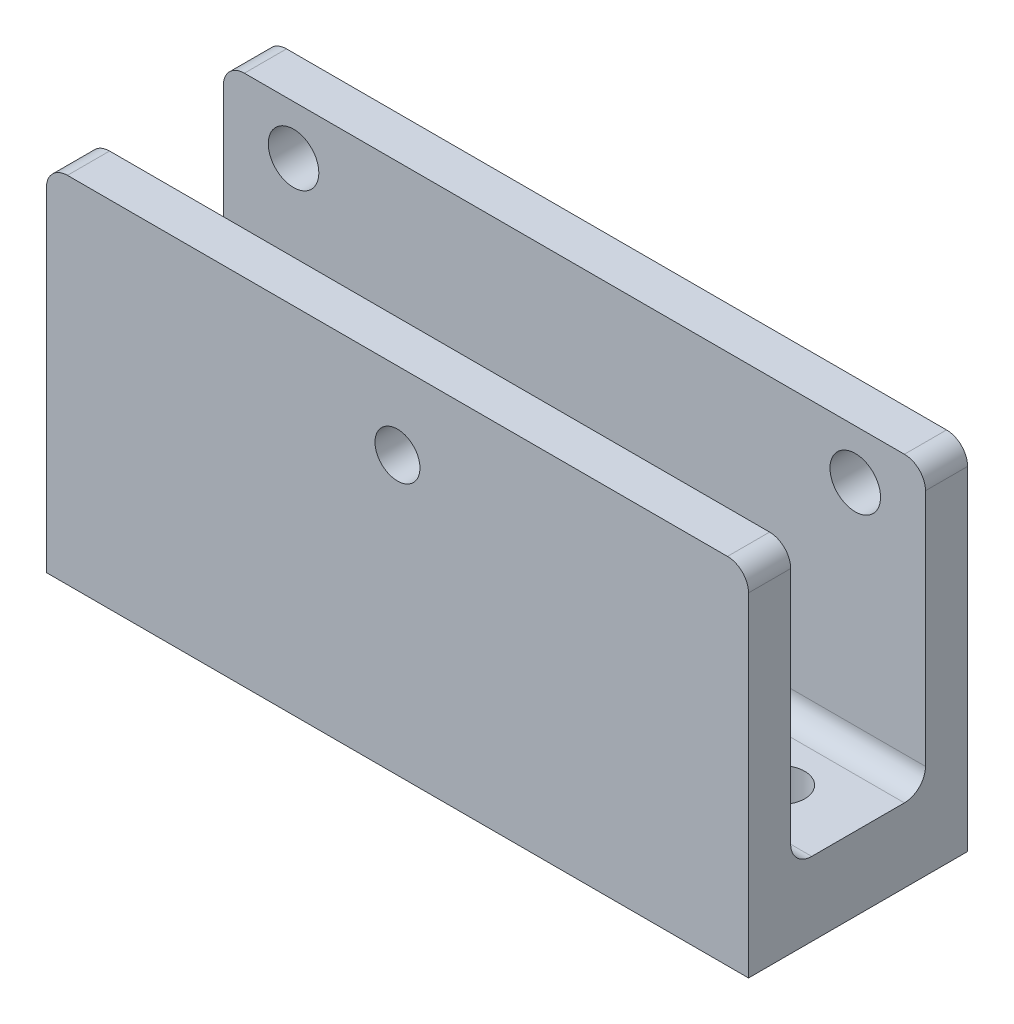
ISO-10303-21;
HEADER;
FILE_DESCRIPTION(('STEP AP214'),'2;1');
FILE_NAME('part.step','',(''),(''),'','','');
FILE_SCHEMA(('AUTOMOTIVE_DESIGN { 1 0 10303 214 1 1 1 1 }'));
ENDSEC;
DATA;
#1=APPLICATION_CONTEXT('core data for automotive mechanical design processes');
#2=APPLICATION_PROTOCOL_DEFINITION('international standard','automotive_design',2000,#1);
#3=PRODUCT_CONTEXT('',#1,'mechanical');
#4=PRODUCT('Part','Part','',(#3));
#5=PRODUCT_RELATED_PRODUCT_CATEGORY('part','',(#4));
#6=PRODUCT_DEFINITION_FORMATION('','',#4);
#7=PRODUCT_DEFINITION_CONTEXT('part definition',#1,'design');
#8=PRODUCT_DEFINITION('design','',#6,#7);
#9=PRODUCT_DEFINITION_SHAPE('','',#8);
#10=(LENGTH_UNIT() NAMED_UNIT(*) SI_UNIT(.MILLI.,.METRE.));
#11=(NAMED_UNIT(*) PLANE_ANGLE_UNIT() SI_UNIT($,.RADIAN.));
#12=(NAMED_UNIT(*) SI_UNIT($,.STERADIAN.) SOLID_ANGLE_UNIT());
#13=UNCERTAINTY_MEASURE_WITH_UNIT(LENGTH_MEASURE(1.E-05),#10,'distance_accuracy_value','');
#14=(GEOMETRIC_REPRESENTATION_CONTEXT(3) GLOBAL_UNCERTAINTY_ASSIGNED_CONTEXT((#13)) GLOBAL_UNIT_ASSIGNED_CONTEXT((#10,
#11,#12)) REPRESENTATION_CONTEXT('',''));
#15=CARTESIAN_POINT('',(0.,0.,0.));
#16=DIRECTION('',(0.,0.,1.));
#17=DIRECTION('',(1.,0.,0.));
#18=AXIS2_PLACEMENT_3D('',#15,#16,#17);
#19=CARTESIAN_POINT('',(25.,5.25,-4.8));
#20=DIRECTION('',(-1.,0.,0.));
#21=DIRECTION('',(0.,0.,1.));
#22=AXIS2_PLACEMENT_3D('',#19,#20,#21);
#23=PLANE('',#22);
#24=DIRECTION('',(0.,1.,0.));
#25=VECTOR('',#24,1.);
#26=CARTESIAN_POINT('',(25.,0.,-7.8));
#27=LINE('',#26,#25);
#28=CARTESIAN_POINT('',(25.,0.,-7.8));
#29=VERTEX_POINT('',#28);
#30=CARTESIAN_POINT('',(25.,23.75,-7.8));
#31=VERTEX_POINT('',#30);
#32=EDGE_CURVE('E171',#29,#31,#27,.T.);
#33=ORIENTED_EDGE('',*,*,#32,.T.);
#34=DIRECTION('',(0.,0.,1.));
#35=VECTOR('',#34,1.);
#36=CARTESIAN_POINT('',(25.,23.75,-4.8));
#37=LINE('',#36,#35);
#38=CARTESIAN_POINT('',(25.,23.75,-4.8));
#39=VERTEX_POINT('',#38);
#40=EDGE_CURVE('E11',#31,#39,#37,.T.);
#41=ORIENTED_EDGE('',*,*,#40,.T.);
#42=DIRECTION('',(0.,1.,0.));
#43=VECTOR('',#42,1.);
#44=CARTESIAN_POINT('',(25.,0.,-4.8));
#45=LINE('',#44,#43);
#46=CARTESIAN_POINT('',(25.,6.75,-4.8));
#47=VERTEX_POINT('',#46);
#48=EDGE_CURVE('E209',#47,#39,#45,.T.);
#49=ORIENTED_EDGE('',*,*,#48,.F.);
#50=CARTESIAN_POINT('',(25.,6.75,-3.3));
#51=DIRECTION('',(-1.,0.,0.));
#52=DIRECTION('',(0.,0.,1.));
#53=AXIS2_PLACEMENT_3D('',#50,#51,#52);
#54=CIRCLE('',#53,1.5);
#55=CARTESIAN_POINT('',(25.,5.25,-3.3));
#56=VERTEX_POINT('',#55);
#57=EDGE_CURVE('E330',#47,#56,#54,.T.);
#58=ORIENTED_EDGE('',*,*,#57,.T.);
#59=DIRECTION('',(0.,0.,-1.));
#60=VECTOR('',#59,1.);
#61=CARTESIAN_POINT('',(25.,5.25,-4.8));
#62=LINE('',#61,#60);
#63=CARTESIAN_POINT('',(25.,5.25,3.3));
#64=VERTEX_POINT('',#63);
#65=EDGE_CURVE('E283',#64,#56,#62,.T.);
#66=ORIENTED_EDGE('',*,*,#65,.F.);
#67=CARTESIAN_POINT('',(25.,6.75,3.3));
#68=DIRECTION('',(-1.,0.,0.));
#69=DIRECTION('',(0.,0.,1.));
#70=AXIS2_PLACEMENT_3D('',#67,#68,#69);
#71=CIRCLE('',#70,1.5);
#72=CARTESIAN_POINT('',(25.,6.75,4.8));
#73=VERTEX_POINT('',#72);
#74=EDGE_CURVE('E320',#64,#73,#71,.T.);
#75=ORIENTED_EDGE('',*,*,#74,.T.);
#76=DIRECTION('',(0.,1.,0.));
#77=VECTOR('',#76,1.);
#78=CARTESIAN_POINT('',(25.,0.,4.8));
#79=LINE('',#78,#77);
#80=CARTESIAN_POINT('',(25.,23.75,4.8));
#81=VERTEX_POINT('',#80);
#82=EDGE_CURVE('E197',#73,#81,#79,.T.);
#83=ORIENTED_EDGE('',*,*,#82,.T.);
#84=DIRECTION('',(0.,0.,-1.));
#85=VECTOR('',#84,1.);
#86=CARTESIAN_POINT('',(25.,23.75,-4.8));
#87=LINE('',#86,#85);
#88=CARTESIAN_POINT('',(25.,23.75,7.8));
#89=VERTEX_POINT('',#88);
#90=EDGE_CURVE('E48',#81,#89,#87,.F.);
#91=ORIENTED_EDGE('',*,*,#90,.T.);
#92=DIRECTION('',(0.,1.,0.));
#93=VECTOR('',#92,1.);
#94=CARTESIAN_POINT('',(25.,0.,7.8));
#95=LINE('',#94,#93);
#96=CARTESIAN_POINT('',(25.,0.,7.8));
#97=VERTEX_POINT('',#96);
#98=EDGE_CURVE('E173',#97,#89,#95,.T.);
#99=ORIENTED_EDGE('',*,*,#98,.F.);
#100=DIRECTION('',(0.,0.,-1.));
#101=VECTOR('',#100,1.);
#102=CARTESIAN_POINT('',(25.,0.,-4.8));
#103=LINE('',#102,#101);
#104=EDGE_CURVE('E170',#97,#29,#103,.T.);
#105=ORIENTED_EDGE('',*,*,#104,.T.);
#106=EDGE_LOOP('',(#33,#41,#49,#58,#66,#75,#83,#91,#99,#105));
#107=FACE_BOUND('',#106,.T.);
#108=ADVANCED_FACE('F39',(#107),#23,.F.);
#109=CARTESIAN_POINT('',(-25.,5.25,-4.8));
#110=DIRECTION('',(1.,0.,0.));
#111=DIRECTION('',(0.,0.,-1.));
#112=AXIS2_PLACEMENT_3D('',#109,#110,#111);
#113=PLANE('',#112);
#114=DIRECTION('',(0.,-1.,0.));
#115=VECTOR('',#114,1.);
#116=CARTESIAN_POINT('',(-25.,0.,7.8));
#117=LINE('',#116,#115);
#118=CARTESIAN_POINT('',(-25.,23.75,7.8));
#119=VERTEX_POINT('',#118);
#120=CARTESIAN_POINT('',(-25.,0.,7.8));
#121=VERTEX_POINT('',#120);
#122=EDGE_CURVE('E214',#119,#121,#117,.T.);
#123=ORIENTED_EDGE('',*,*,#122,.F.);
#124=DIRECTION('',(0.,0.,-1.));
#125=VECTOR('',#124,1.);
#126=CARTESIAN_POINT('',(-25.,23.75,-4.8));
#127=LINE('',#126,#125);
#128=CARTESIAN_POINT('',(-25.,23.75,4.8));
#129=VERTEX_POINT('',#128);
#130=EDGE_CURVE('E336',#119,#129,#127,.T.);
#131=ORIENTED_EDGE('',*,*,#130,.T.);
#132=DIRECTION('',(0.,-1.,0.));
#133=VECTOR('',#132,1.);
#134=CARTESIAN_POINT('',(-25.,0.,4.8));
#135=LINE('',#134,#133);
#136=CARTESIAN_POINT('',(-25.,6.75,4.8));
#137=VERTEX_POINT('',#136);
#138=EDGE_CURVE('E193',#129,#137,#135,.T.);
#139=ORIENTED_EDGE('',*,*,#138,.T.);
#140=CARTESIAN_POINT('',(-25.,6.75,3.3));
#141=DIRECTION('',(1.,0.,0.));
#142=DIRECTION('',(0.,0.,-1.));
#143=AXIS2_PLACEMENT_3D('',#140,#141,#142);
#144=CIRCLE('',#143,1.5);
#145=CARTESIAN_POINT('',(-25.,5.25,3.3));
#146=VERTEX_POINT('',#145);
#147=EDGE_CURVE('E323',#137,#146,#144,.T.);
#148=ORIENTED_EDGE('',*,*,#147,.T.);
#149=DIRECTION('',(0.,0.,1.));
#150=VECTOR('',#149,1.);
#151=CARTESIAN_POINT('',(-25.,5.25,-4.8));
#152=LINE('',#151,#150);
#153=CARTESIAN_POINT('',(-25.,5.25,-3.3));
#154=VERTEX_POINT('',#153);
#155=EDGE_CURVE('E287',#154,#146,#152,.T.);
#156=ORIENTED_EDGE('',*,*,#155,.F.);
#157=CARTESIAN_POINT('',(-25.,6.75,-3.3));
#158=DIRECTION('',(1.,0.,0.));
#159=DIRECTION('',(0.,0.,-1.));
#160=AXIS2_PLACEMENT_3D('',#157,#158,#159);
#161=CIRCLE('',#160,1.5);
#162=CARTESIAN_POINT('',(-25.,6.75,-4.8));
#163=VERTEX_POINT('',#162);
#164=EDGE_CURVE('E326',#154,#163,#161,.T.);
#165=ORIENTED_EDGE('',*,*,#164,.T.);
#166=DIRECTION('',(0.,-1.,0.));
#167=VECTOR('',#166,1.);
#168=CARTESIAN_POINT('',(-25.,0.,-4.8));
#169=LINE('',#168,#167);
#170=CARTESIAN_POINT('',(-25.,23.75,-4.8));
#171=VERTEX_POINT('',#170);
#172=EDGE_CURVE('E201',#171,#163,#169,.T.);
#173=ORIENTED_EDGE('',*,*,#172,.F.);
#174=DIRECTION('',(0.,0.,1.));
#175=VECTOR('',#174,1.);
#176=CARTESIAN_POINT('',(-25.,23.75,-7.8));
#177=LINE('',#176,#175);
#178=CARTESIAN_POINT('',(-25.,23.75,-7.8));
#179=VERTEX_POINT('',#178);
#180=EDGE_CURVE('E333',#171,#179,#177,.F.);
#181=ORIENTED_EDGE('',*,*,#180,.T.);
#182=DIRECTION('',(0.,-1.,0.));
#183=VECTOR('',#182,1.);
#184=CARTESIAN_POINT('',(-25.,0.,-7.8));
#185=LINE('',#184,#183);
#186=CARTESIAN_POINT('',(-25.,0.,-7.8));
#187=VERTEX_POINT('',#186);
#188=EDGE_CURVE('E213',#179,#187,#185,.T.);
#189=ORIENTED_EDGE('',*,*,#188,.T.);
#190=DIRECTION('',(0.,0.,1.));
#191=VECTOR('',#190,1.);
#192=CARTESIAN_POINT('',(-25.,0.,-4.8));
#193=LINE('',#192,#191);
#194=EDGE_CURVE('E179',#187,#121,#193,.T.);
#195=ORIENTED_EDGE('',*,*,#194,.T.);
#196=EDGE_LOOP('',(#123,#131,#139,#148,#156,#165,#173,#181,#189,#195));
#197=FACE_BOUND('',#196,.T.);
#198=ADVANCED_FACE('F397',(#197),#113,.F.);
#199=CARTESIAN_POINT('',(0.,5.25,0.));
#200=DIRECTION('',(0.,1.,0.));
#201=DIRECTION('',(0.,0.,1.));
#202=AXIS2_PLACEMENT_3D('',#199,#200,#201);
#203=PLANE('',#202);
#204=CARTESIAN_POINT('',(-19.5,5.25,0.));
#205=DIRECTION('',(0.,1.,0.));
#206=DIRECTION('',(0.,0.,1.));
#207=AXIS2_PLACEMENT_3D('',#204,#205,#206);
#208=CIRCLE('',#207,1.69999999999999);
#209=CARTESIAN_POINT('',(-19.5,5.25,1.69999999999999));
#210=VERTEX_POINT('',#209);
#211=EDGE_CURVE('E225',#210,#210,#208,.T.);
#212=ORIENTED_EDGE('',*,*,#211,.F.);
#213=EDGE_LOOP('',(#212));
#214=FACE_BOUND('',#213,.T.);
#215=CARTESIAN_POINT('',(-5.5,5.25,0.));
#216=DIRECTION('',(0.,1.,0.));
#217=DIRECTION('',(0.,0.,1.));
#218=AXIS2_PLACEMENT_3D('',#215,#216,#217);
#219=CIRCLE('',#218,1.69999999999999);
#220=CARTESIAN_POINT('',(-5.5,5.25,1.69999999999999));
#221=VERTEX_POINT('',#220);
#222=EDGE_CURVE('E237',#221,#221,#219,.T.);
#223=ORIENTED_EDGE('',*,*,#222,.F.);
#224=EDGE_LOOP('',(#223));
#225=FACE_BOUND('',#224,.T.);
#226=CARTESIAN_POINT('',(5.5,5.25,0.));
#227=DIRECTION('',(0.,1.,0.));
#228=DIRECTION('',(0.,0.,1.));
#229=AXIS2_PLACEMENT_3D('',#226,#227,#228);
#230=CIRCLE('',#229,1.69999999999999);
#231=CARTESIAN_POINT('',(5.5,5.25,1.69999999999999));
#232=VERTEX_POINT('',#231);
#233=EDGE_CURVE('E242',#232,#232,#230,.T.);
#234=ORIENTED_EDGE('',*,*,#233,.F.);
#235=EDGE_LOOP('',(#234));
#236=FACE_BOUND('',#235,.T.);
#237=CARTESIAN_POINT('',(19.5,5.25,0.));
#238=DIRECTION('',(0.,1.,0.));
#239=DIRECTION('',(0.,0.,1.));
#240=AXIS2_PLACEMENT_3D('',#237,#238,#239);
#241=CIRCLE('',#240,1.69999999999999);
#242=CARTESIAN_POINT('',(19.5,5.25,1.69999999999999));
#243=VERTEX_POINT('',#242);
#244=EDGE_CURVE('E247',#243,#243,#241,.T.);
#245=ORIENTED_EDGE('',*,*,#244,.F.);
#246=EDGE_LOOP('',(#245));
#247=FACE_BOUND('',#246,.T.);
#248=ORIENTED_EDGE('',*,*,#155,.T.);
#249=DIRECTION('',(1.,0.,0.));
#250=VECTOR('',#249,1.);
#251=CARTESIAN_POINT('',(25.,5.25,3.3));
#252=LINE('',#251,#250);
#253=EDGE_CURVE('E309',#146,#64,#252,.T.);
#254=ORIENTED_EDGE('',*,*,#253,.T.);
#255=ORIENTED_EDGE('',*,*,#65,.T.);
#256=DIRECTION('',(-1.,0.,0.));
#257=VECTOR('',#256,1.);
#258=CARTESIAN_POINT('',(-25.,5.25,-3.3));
#259=LINE('',#258,#257);
#260=EDGE_CURVE('E290',#56,#154,#259,.T.);
#261=ORIENTED_EDGE('',*,*,#260,.T.);
#262=EDGE_LOOP('',(#248,#254,#255,#261));
#263=FACE_BOUND('',#262,.T.);
#264=ADVANCED_FACE('F481',(#214,#225,#236,#247,#263),#203,.T.);
#265=CARTESIAN_POINT('',(0.,0.,0.));
#266=DIRECTION('',(0.,1.,0.));
#267=DIRECTION('',(0.,0.,1.));
#268=AXIS2_PLACEMENT_3D('',#265,#266,#267);
#269=PLANE('',#268);
#270=CARTESIAN_POINT('',(-19.5,0.,0.));
#271=DIRECTION('',(0.,-1.,0.));
#272=DIRECTION('',(0.,0.,-1.));
#273=AXIS2_PLACEMENT_3D('',#270,#271,#272);
#274=CIRCLE('',#273,2.5);
#275=CARTESIAN_POINT('',(-19.5,0.,-2.5));
#276=VERTEX_POINT('',#275);
#277=EDGE_CURVE('E255',#276,#276,#274,.T.);
#278=ORIENTED_EDGE('',*,*,#277,.F.);
#279=EDGE_LOOP('',(#278));
#280=FACE_BOUND('',#279,.T.);
#281=CARTESIAN_POINT('',(-5.5,0.,0.));
#282=DIRECTION('',(0.,-1.,0.));
#283=DIRECTION('',(0.,0.,-1.));
#284=AXIS2_PLACEMENT_3D('',#281,#282,#283);
#285=CIRCLE('',#284,2.5);
#286=CARTESIAN_POINT('',(-5.5,0.,-2.5));
#287=VERTEX_POINT('',#286);
#288=EDGE_CURVE('E263',#287,#287,#285,.T.);
#289=ORIENTED_EDGE('',*,*,#288,.F.);
#290=EDGE_LOOP('',(#289));
#291=FACE_BOUND('',#290,.T.);
#292=CARTESIAN_POINT('',(5.5,0.,0.));
#293=DIRECTION('',(0.,-1.,0.));
#294=DIRECTION('',(0.,0.,-1.));
#295=AXIS2_PLACEMENT_3D('',#292,#293,#294);
#296=CIRCLE('',#295,2.5);
#297=CARTESIAN_POINT('',(5.5,0.,-2.5));
#298=VERTEX_POINT('',#297);
#299=EDGE_CURVE('E271',#298,#298,#296,.T.);
#300=ORIENTED_EDGE('',*,*,#299,.F.);
#301=EDGE_LOOP('',(#300));
#302=FACE_BOUND('',#301,.T.);
#303=CARTESIAN_POINT('',(19.5,0.,0.));
#304=DIRECTION('',(0.,-1.,0.));
#305=DIRECTION('',(0.,0.,-1.));
#306=AXIS2_PLACEMENT_3D('',#303,#304,#305);
#307=CIRCLE('',#306,2.5);
#308=CARTESIAN_POINT('',(19.5,0.,-2.5));
#309=VERTEX_POINT('',#308);
#310=EDGE_CURVE('E279',#309,#309,#307,.T.);
#311=ORIENTED_EDGE('',*,*,#310,.F.);
#312=EDGE_LOOP('',(#311));
#313=FACE_BOUND('',#312,.T.);
#314=ORIENTED_EDGE('',*,*,#104,.F.);
#315=DIRECTION('',(1.,0.,0.));
#316=VECTOR('',#315,1.);
#317=CARTESIAN_POINT('',(-25.,0.,7.8));
#318=LINE('',#317,#316);
#319=EDGE_CURVE('E217',#121,#97,#318,.T.);
#320=ORIENTED_EDGE('',*,*,#319,.F.);
#321=ORIENTED_EDGE('',*,*,#194,.F.);
#322=DIRECTION('',(1.,0.,0.));
#323=VECTOR('',#322,1.);
#324=CARTESIAN_POINT('',(-25.,0.,-7.8));
#325=LINE('',#324,#323);
#326=EDGE_CURVE('E185',#187,#29,#325,.T.);
#327=ORIENTED_EDGE('',*,*,#326,.T.);
#328=EDGE_LOOP('',(#314,#320,#321,#327));
#329=FACE_BOUND('',#328,.T.);
#330=ADVANCED_FACE('F190',(#280,#291,#302,#313,#329),#269,.F.);
#331=CARTESIAN_POINT('',(19.5,2.1,0.));
#332=DIRECTION('',(0.,-1.,0.));
#333=DIRECTION('',(0.,0.,-1.));
#334=AXIS2_PLACEMENT_3D('',#331,#332,#333);
#335=CYLINDRICAL_SURFACE('',#334,2.5);
#336=CARTESIAN_POINT('',(19.5,2.1,0.));
#337=DIRECTION('',(0.,-1.,0.));
#338=DIRECTION('',(0.,0.,-1.));
#339=AXIS2_PLACEMENT_3D('',#336,#337,#338);
#340=CIRCLE('',#339,2.5);
#341=CARTESIAN_POINT('',(19.5,2.1,-2.5));
#342=VERTEX_POINT('',#341);
#343=EDGE_CURVE('E275',#342,#342,#340,.T.);
#344=ORIENTED_EDGE('',*,*,#343,.F.);
#345=EDGE_LOOP('',(#344));
#346=FACE_BOUND('',#345,.T.);
#347=ORIENTED_EDGE('',*,*,#310,.T.);
#348=EDGE_LOOP('',(#347));
#349=FACE_BOUND('',#348,.T.);
#350=ADVANCED_FACE('F574',(#346,#349),#335,.F.);
#351=CARTESIAN_POINT('',(19.5,2.1,0.));
#352=DIRECTION('',(0.,-1.,0.));
#353=DIRECTION('',(0.,0.,-1.));
#354=AXIS2_PLACEMENT_3D('',#351,#352,#353);
#355=PLANE('',#354);
#356=CARTESIAN_POINT('',(19.5,2.1,0.));
#357=DIRECTION('',(0.,-1.,0.));
#358=DIRECTION('',(0.,0.,-1.));
#359=AXIS2_PLACEMENT_3D('',#356,#357,#358);
#360=CIRCLE('',#359,1.69999999999999);
#361=CARTESIAN_POINT('',(19.5,2.1,-1.69999999999999));
#362=VERTEX_POINT('',#361);
#363=EDGE_CURVE('E251',#362,#362,#360,.T.);
#364=ORIENTED_EDGE('',*,*,#363,.F.);
#365=EDGE_LOOP('',(#364));
#366=FACE_BOUND('',#365,.T.);
#367=ORIENTED_EDGE('',*,*,#343,.T.);
#368=EDGE_LOOP('',(#367));
#369=FACE_BOUND('',#368,.T.);
#370=ADVANCED_FACE('F570',(#366,#369),#355,.T.);
#371=CARTESIAN_POINT('',(5.5,2.1,0.));
#372=DIRECTION('',(0.,-1.,0.));
#373=DIRECTION('',(0.,0.,-1.));
#374=AXIS2_PLACEMENT_3D('',#371,#372,#373);
#375=CYLINDRICAL_SURFACE('',#374,2.5);
#376=CARTESIAN_POINT('',(5.5,2.1,0.));
#377=DIRECTION('',(0.,-1.,0.));
#378=DIRECTION('',(0.,0.,-1.));
#379=AXIS2_PLACEMENT_3D('',#376,#377,#378);
#380=CIRCLE('',#379,2.5);
#381=CARTESIAN_POINT('',(5.5,2.1,-2.5));
#382=VERTEX_POINT('',#381);
#383=EDGE_CURVE('E267',#382,#382,#380,.T.);
#384=ORIENTED_EDGE('',*,*,#383,.F.);
#385=EDGE_LOOP('',(#384));
#386=FACE_BOUND('',#385,.T.);
#387=ORIENTED_EDGE('',*,*,#299,.T.);
#388=EDGE_LOOP('',(#387));
#389=FACE_BOUND('',#388,.T.);
#390=ADVANCED_FACE('F566',(#386,#389),#375,.F.);
#391=CARTESIAN_POINT('',(5.5,2.1,0.));
#392=DIRECTION('',(0.,-1.,0.));
#393=DIRECTION('',(0.,0.,-1.));
#394=AXIS2_PLACEMENT_3D('',#391,#392,#393);
#395=PLANE('',#394);
#396=CARTESIAN_POINT('',(5.5,2.1,0.));
#397=DIRECTION('',(0.,-1.,0.));
#398=DIRECTION('',(0.,0.,-1.));
#399=AXIS2_PLACEMENT_3D('',#396,#397,#398);
#400=CIRCLE('',#399,1.69999999999999);
#401=CARTESIAN_POINT('',(5.5,2.1,-1.69999999999999));
#402=VERTEX_POINT('',#401);
#403=EDGE_CURVE('E246',#402,#402,#400,.T.);
#404=ORIENTED_EDGE('',*,*,#403,.F.);
#405=EDGE_LOOP('',(#404));
#406=FACE_BOUND('',#405,.T.);
#407=ORIENTED_EDGE('',*,*,#383,.T.);
#408=EDGE_LOOP('',(#407));
#409=FACE_BOUND('',#408,.T.);
#410=ADVANCED_FACE('F562',(#406,#409),#395,.T.);
#411=CARTESIAN_POINT('',(-5.5,2.1,0.));
#412=DIRECTION('',(0.,-1.,0.));
#413=DIRECTION('',(0.,0.,-1.));
#414=AXIS2_PLACEMENT_3D('',#411,#412,#413);
#415=CYLINDRICAL_SURFACE('',#414,2.5);
#416=CARTESIAN_POINT('',(-5.5,2.1,0.));
#417=DIRECTION('',(0.,-1.,0.));
#418=DIRECTION('',(0.,0.,-1.));
#419=AXIS2_PLACEMENT_3D('',#416,#417,#418);
#420=CIRCLE('',#419,2.5);
#421=CARTESIAN_POINT('',(-5.5,2.1,-2.5));
#422=VERTEX_POINT('',#421);
#423=EDGE_CURVE('E259',#422,#422,#420,.T.);
#424=ORIENTED_EDGE('',*,*,#423,.F.);
#425=EDGE_LOOP('',(#424));
#426=FACE_BOUND('',#425,.T.);
#427=ORIENTED_EDGE('',*,*,#288,.T.);
#428=EDGE_LOOP('',(#427));
#429=FACE_BOUND('',#428,.T.);
#430=ADVANCED_FACE('F558',(#426,#429),#415,.F.);
#431=CARTESIAN_POINT('',(-5.5,2.1,0.));
#432=DIRECTION('',(0.,-1.,0.));
#433=DIRECTION('',(0.,0.,-1.));
#434=AXIS2_PLACEMENT_3D('',#431,#432,#433);
#435=PLANE('',#434);
#436=CARTESIAN_POINT('',(-5.5,2.1,0.));
#437=DIRECTION('',(0.,-1.,0.));
#438=DIRECTION('',(0.,0.,-1.));
#439=AXIS2_PLACEMENT_3D('',#436,#437,#438);
#440=CIRCLE('',#439,1.69999999999999);
#441=CARTESIAN_POINT('',(-5.5,2.1,-1.69999999999999));
#442=VERTEX_POINT('',#441);
#443=EDGE_CURVE('E241',#442,#442,#440,.T.);
#444=ORIENTED_EDGE('',*,*,#443,.F.);
#445=EDGE_LOOP('',(#444));
#446=FACE_BOUND('',#445,.T.);
#447=ORIENTED_EDGE('',*,*,#423,.T.);
#448=EDGE_LOOP('',(#447));
#449=FACE_BOUND('',#448,.T.);
#450=ADVANCED_FACE('F554',(#446,#449),#435,.T.);
#451=CARTESIAN_POINT('',(-19.5,2.1,0.));
#452=DIRECTION('',(0.,-1.,0.));
#453=DIRECTION('',(0.,0.,-1.));
#454=AXIS2_PLACEMENT_3D('',#451,#452,#453);
#455=CYLINDRICAL_SURFACE('',#454,2.5);
#456=CARTESIAN_POINT('',(-19.5,2.1,0.));
#457=DIRECTION('',(0.,-1.,0.));
#458=DIRECTION('',(0.,0.,-1.));
#459=AXIS2_PLACEMENT_3D('',#456,#457,#458);
#460=CIRCLE('',#459,2.5);
#461=CARTESIAN_POINT('',(-19.5,2.1,-2.5));
#462=VERTEX_POINT('',#461);
#463=EDGE_CURVE('E180',#462,#462,#460,.T.);
#464=ORIENTED_EDGE('',*,*,#463,.F.);
#465=EDGE_LOOP('',(#464));
#466=FACE_BOUND('',#465,.T.);
#467=ORIENTED_EDGE('',*,*,#277,.T.);
#468=EDGE_LOOP('',(#467));
#469=FACE_BOUND('',#468,.T.);
#470=ADVANCED_FACE('F550',(#466,#469),#455,.F.);
#471=CARTESIAN_POINT('',(-19.5,2.1,0.));
#472=DIRECTION('',(0.,-1.,0.));
#473=DIRECTION('',(0.,0.,-1.));
#474=AXIS2_PLACEMENT_3D('',#471,#472,#473);
#475=PLANE('',#474);
#476=CARTESIAN_POINT('',(-19.5,2.1,0.));
#477=DIRECTION('',(0.,-1.,0.));
#478=DIRECTION('',(0.,0.,-1.));
#479=AXIS2_PLACEMENT_3D('',#476,#477,#478);
#480=CIRCLE('',#479,1.69999999999999);
#481=CARTESIAN_POINT('',(-19.5,2.1,-1.69999999999999));
#482=VERTEX_POINT('',#481);
#483=EDGE_CURVE('E236',#482,#482,#480,.T.);
#484=ORIENTED_EDGE('',*,*,#483,.F.);
#485=EDGE_LOOP('',(#484));
#486=FACE_BOUND('',#485,.T.);
#487=ORIENTED_EDGE('',*,*,#463,.T.);
#488=EDGE_LOOP('',(#487));
#489=FACE_BOUND('',#488,.T.);
#490=ADVANCED_FACE('F546',(#486,#489),#475,.T.);
#491=CARTESIAN_POINT('',(19.5,5.25,0.));
#492=DIRECTION('',(0.,1.,0.));
#493=DIRECTION('',(0.,0.,1.));
#494=AXIS2_PLACEMENT_3D('',#491,#492,#493);
#495=CYLINDRICAL_SURFACE('',#494,1.69999999999999);
#496=ORIENTED_EDGE('',*,*,#363,.T.);
#497=EDGE_LOOP('',(#496));
#498=FACE_BOUND('',#497,.T.);
#499=ORIENTED_EDGE('',*,*,#244,.T.);
#500=EDGE_LOOP('',(#499));
#501=FACE_BOUND('',#500,.T.);
#502=ADVANCED_FACE('F542',(#498,#501),#495,.F.);
#503=CARTESIAN_POINT('',(5.5,5.25,0.));
#504=DIRECTION('',(0.,1.,0.));
#505=DIRECTION('',(0.,0.,1.));
#506=AXIS2_PLACEMENT_3D('',#503,#504,#505);
#507=CYLINDRICAL_SURFACE('',#506,1.69999999999999);
#508=ORIENTED_EDGE('',*,*,#403,.T.);
#509=EDGE_LOOP('',(#508));
#510=FACE_BOUND('',#509,.T.);
#511=ORIENTED_EDGE('',*,*,#233,.T.);
#512=EDGE_LOOP('',(#511));
#513=FACE_BOUND('',#512,.T.);
#514=ADVANCED_FACE('F538',(#510,#513),#507,.F.);
#515=CARTESIAN_POINT('',(-5.5,5.25,0.));
#516=DIRECTION('',(0.,1.,0.));
#517=DIRECTION('',(0.,0.,1.));
#518=AXIS2_PLACEMENT_3D('',#515,#516,#517);
#519=CYLINDRICAL_SURFACE('',#518,1.69999999999999);
#520=ORIENTED_EDGE('',*,*,#443,.T.);
#521=EDGE_LOOP('',(#520));
#522=FACE_BOUND('',#521,.T.);
#523=ORIENTED_EDGE('',*,*,#222,.T.);
#524=EDGE_LOOP('',(#523));
#525=FACE_BOUND('',#524,.T.);
#526=ADVANCED_FACE('F534',(#522,#525),#519,.F.);
#527=CARTESIAN_POINT('',(-19.5,5.25,0.));
#528=DIRECTION('',(0.,1.,0.));
#529=DIRECTION('',(0.,0.,1.));
#530=AXIS2_PLACEMENT_3D('',#527,#528,#529);
#531=CYLINDRICAL_SURFACE('',#530,1.69999999999999);
#532=ORIENTED_EDGE('',*,*,#483,.T.);
#533=EDGE_LOOP('',(#532));
#534=FACE_BOUND('',#533,.T.);
#535=ORIENTED_EDGE('',*,*,#211,.T.);
#536=EDGE_LOOP('',(#535));
#537=FACE_BOUND('',#536,.T.);
#538=ADVANCED_FACE('F529',(#534,#537),#531,.F.);
#539=CARTESIAN_POINT('',(0.,0.,4.8));
#540=DIRECTION('',(0.,0.,-1.));
#541=DIRECTION('',(-1.,0.,0.));
#542=AXIS2_PLACEMENT_3D('',#539,#540,#541);
#543=PLANE('',#542);
#544=CARTESIAN_POINT('',(0.,19.75,4.8));
#545=DIRECTION('',(0.,0.,-1.));
#546=DIRECTION('',(-1.,0.,0.));
#547=AXIS2_PLACEMENT_3D('',#544,#545,#546);
#548=CIRCLE('',#547,1.6);
#549=CARTESIAN_POINT('',(-1.6,19.75,4.8));
#550=VERTEX_POINT('',#549);
#551=EDGE_CURVE('E205',#550,#550,#548,.T.);
#552=ORIENTED_EDGE('',*,*,#551,.F.);
#553=EDGE_LOOP('',(#552));
#554=FACE_BOUND('',#553,.T.);
#555=ORIENTED_EDGE('',*,*,#138,.F.);
#556=CARTESIAN_POINT('',(-23.5,23.75,4.8));
#557=DIRECTION('',(0.,0.,-1.));
#558=DIRECTION('',(-1.,0.,0.));
#559=AXIS2_PLACEMENT_3D('',#556,#557,#558);
#560=CIRCLE('',#559,1.5);
#561=CARTESIAN_POINT('',(-23.5,25.25,4.8));
#562=VERTEX_POINT('',#561);
#563=EDGE_CURVE('E343',#129,#562,#560,.T.);
#564=ORIENTED_EDGE('',*,*,#563,.T.);
#565=DIRECTION('',(-1.,0.,0.));
#566=VECTOR('',#565,1.);
#567=CARTESIAN_POINT('',(-25.,25.25,4.8));
#568=LINE('',#567,#566);
#569=CARTESIAN_POINT('',(23.5,25.25,4.8));
#570=VERTEX_POINT('',#569);
#571=EDGE_CURVE('E218',#570,#562,#568,.T.);
#572=ORIENTED_EDGE('',*,*,#571,.F.);
#573=CARTESIAN_POINT('',(23.5,23.75,4.8));
#574=DIRECTION('',(0.,0.,-1.));
#575=DIRECTION('',(-1.,0.,0.));
#576=AXIS2_PLACEMENT_3D('',#573,#574,#575);
#577=CIRCLE('',#576,1.5);
#578=EDGE_CURVE('E340',#570,#81,#577,.T.);
#579=ORIENTED_EDGE('',*,*,#578,.T.);
#580=ORIENTED_EDGE('',*,*,#82,.F.);
#581=DIRECTION('',(1.,0.,0.));
#582=VECTOR('',#581,1.);
#583=CARTESIAN_POINT('',(-25.,6.75,4.8));
#584=LINE('',#583,#582);
#585=EDGE_CURVE('E313',#73,#137,#584,.F.);
#586=ORIENTED_EDGE('',*,*,#585,.T.);
#587=EDGE_LOOP('',(#555,#564,#572,#579,#580,#586));
#588=FACE_BOUND('',#587,.T.);
#589=ADVANCED_FACE('F390',(#554,#588),#543,.T.);
#590=CARTESIAN_POINT('',(-25.,25.25,7.8));
#591=DIRECTION('',(0.,-1.,0.));
#592=DIRECTION('',(0.,0.,-1.));
#593=AXIS2_PLACEMENT_3D('',#590,#591,#592);
#594=PLANE('',#593);
#595=ORIENTED_EDGE('',*,*,#571,.T.);
#596=DIRECTION('',(0.,0.,-1.));
#597=VECTOR('',#596,1.);
#598=CARTESIAN_POINT('',(-23.5,25.25,7.8));
#599=LINE('',#598,#597);
#600=CARTESIAN_POINT('',(-23.5,25.25,7.8));
#601=VERTEX_POINT('',#600);
#602=EDGE_CURVE('E350',#562,#601,#599,.F.);
#603=ORIENTED_EDGE('',*,*,#602,.T.);
#604=DIRECTION('',(-1.,0.,0.));
#605=VECTOR('',#604,1.);
#606=CARTESIAN_POINT('',(-25.,25.25,7.8));
#607=LINE('',#606,#605);
#608=CARTESIAN_POINT('',(23.5,25.25,7.8));
#609=VERTEX_POINT('',#608);
#610=EDGE_CURVE('E222',#609,#601,#607,.T.);
#611=ORIENTED_EDGE('',*,*,#610,.F.);
#612=DIRECTION('',(0.,0.,-1.));
#613=VECTOR('',#612,1.);
#614=CARTESIAN_POINT('',(23.5,25.25,7.8));
#615=LINE('',#614,#613);
#616=EDGE_CURVE('E346',#609,#570,#615,.T.);
#617=ORIENTED_EDGE('',*,*,#616,.T.);
#618=EDGE_LOOP('',(#595,#603,#611,#617));
#619=FACE_BOUND('',#618,.T.);
#620=ADVANCED_FACE('F386',(#619),#594,.F.);
#621=CARTESIAN_POINT('',(0.,0.,7.8));
#622=DIRECTION('',(0.,0.,-1.));
#623=DIRECTION('',(-1.,0.,0.));
#624=AXIS2_PLACEMENT_3D('',#621,#622,#623);
#625=PLANE('',#624);
#626=CARTESIAN_POINT('',(0.,19.75,7.8));
#627=DIRECTION('',(0.,0.,1.));
#628=DIRECTION('',(1.,0.,0.));
#629=AXIS2_PLACEMENT_3D('',#626,#627,#628);
#630=CIRCLE('',#629,1.6);
#631=CARTESIAN_POINT('',(1.6,19.75,7.8));
#632=VERTEX_POINT('',#631);
#633=EDGE_CURVE('E409',#632,#632,#630,.T.);
#634=ORIENTED_EDGE('',*,*,#633,.F.);
#635=EDGE_LOOP('',(#634));
#636=FACE_BOUND('',#635,.T.);
#637=ORIENTED_EDGE('',*,*,#610,.T.);
#638=CARTESIAN_POINT('',(-23.5,23.75,7.8));
#639=DIRECTION('',(0.,0.,-1.));
#640=DIRECTION('',(-1.,0.,0.));
#641=AXIS2_PLACEMENT_3D('',#638,#639,#640);
#642=CIRCLE('',#641,1.5);
#643=EDGE_CURVE('E356',#601,#119,#642,.F.);
#644=ORIENTED_EDGE('',*,*,#643,.T.);
#645=ORIENTED_EDGE('',*,*,#122,.T.);
#646=ORIENTED_EDGE('',*,*,#319,.T.);
#647=ORIENTED_EDGE('',*,*,#98,.T.);
#648=CARTESIAN_POINT('',(23.5,23.75,7.8));
#649=DIRECTION('',(0.,0.,-1.));
#650=DIRECTION('',(-1.,0.,0.));
#651=AXIS2_PLACEMENT_3D('',#648,#649,#650);
#652=CIRCLE('',#651,1.5);
#653=EDGE_CURVE('E353',#89,#609,#652,.F.);
#654=ORIENTED_EDGE('',*,*,#653,.T.);
#655=EDGE_LOOP('',(#637,#644,#645,#646,#647,#654));
#656=FACE_BOUND('',#655,.T.);
#657=ADVANCED_FACE('F381',(#636,#656),#625,.F.);
#658=CARTESIAN_POINT('',(0.,0.,-4.8));
#659=DIRECTION('',(0.,0.,1.));
#660=DIRECTION('',(-1.,0.,0.));
#661=AXIS2_PLACEMENT_3D('',#658,#659,#660);
#662=PLANE('',#661);
#663=CARTESIAN_POINT('',(20.,21.75,-4.8));
#664=DIRECTION('',(0.,0.,1.));
#665=DIRECTION('',(1.,0.,0.));
#666=AXIS2_PLACEMENT_3D('',#663,#664,#665);
#667=CIRCLE('',#666,1.8);
#668=CARTESIAN_POINT('',(21.8,21.75,-4.8));
#669=VERTEX_POINT('',#668);
#670=EDGE_CURVE('E437',#669,#669,#667,.T.);
#671=ORIENTED_EDGE('',*,*,#670,.F.);
#672=EDGE_LOOP('',(#671));
#673=FACE_BOUND('',#672,.T.);
#674=CARTESIAN_POINT('',(-20.,21.75,-4.8));
#675=DIRECTION('',(0.,0.,1.));
#676=DIRECTION('',(1.,0.,0.));
#677=AXIS2_PLACEMENT_3D('',#674,#675,#676);
#678=CIRCLE('',#677,1.8);
#679=CARTESIAN_POINT('',(-18.2,21.75,-4.8));
#680=VERTEX_POINT('',#679);
#681=EDGE_CURVE('E429',#680,#680,#678,.T.);
#682=ORIENTED_EDGE('',*,*,#681,.F.);
#683=EDGE_LOOP('',(#682));
#684=FACE_BOUND('',#683,.T.);
#685=CARTESIAN_POINT('',(-12.75,11.75,-4.8));
#686=DIRECTION('',(0.,0.,1.));
#687=DIRECTION('',(1.,0.,0.));
#688=AXIS2_PLACEMENT_3D('',#685,#686,#687);
#689=CIRCLE('',#688,1.8);
#690=CARTESIAN_POINT('',(-10.95,11.75,-4.8));
#691=VERTEX_POINT('',#690);
#692=EDGE_CURVE('E421',#691,#691,#689,.T.);
#693=ORIENTED_EDGE('',*,*,#692,.F.);
#694=EDGE_LOOP('',(#693));
#695=FACE_BOUND('',#694,.T.);
#696=CARTESIAN_POINT('',(12.75,11.75,-4.8));
#697=DIRECTION('',(0.,0.,1.));
#698=DIRECTION('',(1.,0.,0.));
#699=AXIS2_PLACEMENT_3D('',#696,#697,#698);
#700=CIRCLE('',#699,1.8);
#701=CARTESIAN_POINT('',(14.55,11.75,-4.8));
#702=VERTEX_POINT('',#701);
#703=EDGE_CURVE('E413',#702,#702,#700,.T.);
#704=ORIENTED_EDGE('',*,*,#703,.F.);
#705=EDGE_LOOP('',(#704));
#706=FACE_BOUND('',#705,.T.);
#707=DIRECTION('',(-1.,0.,0.));
#708=VECTOR('',#707,1.);
#709=CARTESIAN_POINT('',(-25.,25.25,-4.8));
#710=LINE('',#709,#708);
#711=CARTESIAN_POINT('',(23.5,25.25,-4.8));
#712=VERTEX_POINT('',#711);
#713=CARTESIAN_POINT('',(-23.5,25.25,-4.8));
#714=VERTEX_POINT('',#713);
#715=EDGE_CURVE('E204',#712,#714,#710,.T.);
#716=ORIENTED_EDGE('',*,*,#715,.T.);
#717=CARTESIAN_POINT('',(-23.5,23.75,-4.8));
#718=DIRECTION('',(0.,0.,1.));
#719=DIRECTION('',(1.,0.,0.));
#720=AXIS2_PLACEMENT_3D('',#717,#718,#719);
#721=CIRCLE('',#720,1.5);
#722=EDGE_CURVE('E368',#714,#171,#721,.T.);
#723=ORIENTED_EDGE('',*,*,#722,.T.);
#724=ORIENTED_EDGE('',*,*,#172,.T.);
#725=DIRECTION('',(-1.,0.,0.));
#726=VECTOR('',#725,1.);
#727=CARTESIAN_POINT('',(25.,6.75,-4.8));
#728=LINE('',#727,#726);
#729=EDGE_CURVE('E317',#163,#47,#728,.F.);
#730=ORIENTED_EDGE('',*,*,#729,.T.);
#731=ORIENTED_EDGE('',*,*,#48,.T.);
#732=CARTESIAN_POINT('',(23.5,23.75,-4.8));
#733=DIRECTION('',(0.,0.,1.));
#734=DIRECTION('',(1.,0.,0.));
#735=AXIS2_PLACEMENT_3D('',#732,#733,#734);
#736=CIRCLE('',#735,1.5);
#737=EDGE_CURVE('E67',#39,#712,#736,.T.);
#738=ORIENTED_EDGE('',*,*,#737,.T.);
#739=EDGE_LOOP('',(#716,#723,#724,#730,#731,#738));
#740=FACE_BOUND('',#739,.T.);
#741=ADVANCED_FACE('F504',(#673,#684,#695,#706,#740),#662,.T.);
#742=CARTESIAN_POINT('',(-25.,25.25,-7.8));
#743=DIRECTION('',(0.,1.,0.));
#744=DIRECTION('',(0.,0.,1.));
#745=AXIS2_PLACEMENT_3D('',#742,#743,#744);
#746=PLANE('',#745);
#747=DIRECTION('',(-1.,0.,0.));
#748=VECTOR('',#747,1.);
#749=CARTESIAN_POINT('',(-25.,25.25,-7.8));
#750=LINE('',#749,#748);
#751=CARTESIAN_POINT('',(23.5,25.25,-7.8));
#752=VERTEX_POINT('',#751);
#753=CARTESIAN_POINT('',(-23.5,25.25,-7.8));
#754=VERTEX_POINT('',#753);
#755=EDGE_CURVE('E187',#752,#754,#750,.T.);
#756=ORIENTED_EDGE('',*,*,#755,.T.);
#757=DIRECTION('',(0.,0.,1.));
#758=VECTOR('',#757,1.);
#759=CARTESIAN_POINT('',(-23.5,25.25,-4.8));
#760=LINE('',#759,#758);
#761=EDGE_CURVE('E362',#754,#714,#760,.T.);
#762=ORIENTED_EDGE('',*,*,#761,.T.);
#763=ORIENTED_EDGE('',*,*,#715,.F.);
#764=DIRECTION('',(0.,0.,1.));
#765=VECTOR('',#764,1.);
#766=CARTESIAN_POINT('',(23.5,25.25,-7.8));
#767=LINE('',#766,#765);
#768=EDGE_CURVE('E359',#712,#752,#767,.F.);
#769=ORIENTED_EDGE('',*,*,#768,.T.);
#770=EDGE_LOOP('',(#756,#762,#763,#769));
#771=FACE_BOUND('',#770,.T.);
#772=ADVANCED_FACE('F451',(#771),#746,.T.);
#773=CARTESIAN_POINT('',(0.,0.,-7.8));
#774=DIRECTION('',(0.,0.,1.));
#775=DIRECTION('',(-1.,0.,0.));
#776=AXIS2_PLACEMENT_3D('',#773,#774,#775);
#777=PLANE('',#776);
#778=CARTESIAN_POINT('',(20.,21.75,-7.8));
#779=DIRECTION('',(0.,0.,-1.));
#780=DIRECTION('',(-1.,0.,0.));
#781=AXIS2_PLACEMENT_3D('',#778,#779,#780);
#782=CIRCLE('',#781,1.8);
#783=CARTESIAN_POINT('',(18.2,21.75,-7.8));
#784=VERTEX_POINT('',#783);
#785=EDGE_CURVE('E441',#784,#784,#782,.T.);
#786=ORIENTED_EDGE('',*,*,#785,.F.);
#787=EDGE_LOOP('',(#786));
#788=FACE_BOUND('',#787,.T.);
#789=CARTESIAN_POINT('',(-20.,21.75,-7.8));
#790=DIRECTION('',(0.,0.,-1.));
#791=DIRECTION('',(-1.,0.,0.));
#792=AXIS2_PLACEMENT_3D('',#789,#790,#791);
#793=CIRCLE('',#792,1.8);
#794=CARTESIAN_POINT('',(-21.8,21.75,-7.8));
#795=VERTEX_POINT('',#794);
#796=EDGE_CURVE('E433',#795,#795,#793,.T.);
#797=ORIENTED_EDGE('',*,*,#796,.F.);
#798=EDGE_LOOP('',(#797));
#799=FACE_BOUND('',#798,.T.);
#800=CARTESIAN_POINT('',(-12.75,11.75,-7.8));
#801=DIRECTION('',(0.,0.,-1.));
#802=DIRECTION('',(-1.,0.,0.));
#803=AXIS2_PLACEMENT_3D('',#800,#801,#802);
#804=CIRCLE('',#803,1.8);
#805=CARTESIAN_POINT('',(-14.55,11.75,-7.8));
#806=VERTEX_POINT('',#805);
#807=EDGE_CURVE('E425',#806,#806,#804,.T.);
#808=ORIENTED_EDGE('',*,*,#807,.F.);
#809=EDGE_LOOP('',(#808));
#810=FACE_BOUND('',#809,.T.);
#811=CARTESIAN_POINT('',(12.75,11.75,-7.8));
#812=DIRECTION('',(0.,0.,-1.));
#813=DIRECTION('',(-1.,0.,0.));
#814=AXIS2_PLACEMENT_3D('',#811,#812,#813);
#815=CIRCLE('',#814,1.8);
#816=CARTESIAN_POINT('',(10.95,11.75,-7.8));
#817=VERTEX_POINT('',#816);
#818=EDGE_CURVE('E417',#817,#817,#815,.T.);
#819=ORIENTED_EDGE('',*,*,#818,.F.);
#820=EDGE_LOOP('',(#819));
#821=FACE_BOUND('',#820,.T.);
#822=ORIENTED_EDGE('',*,*,#188,.F.);
#823=CARTESIAN_POINT('',(-23.5,23.75,-7.8));
#824=DIRECTION('',(0.,0.,1.));
#825=DIRECTION('',(1.,0.,0.));
#826=AXIS2_PLACEMENT_3D('',#823,#824,#825);
#827=CIRCLE('',#826,1.5);
#828=EDGE_CURVE('E373',#179,#754,#827,.F.);
#829=ORIENTED_EDGE('',*,*,#828,.T.);
#830=ORIENTED_EDGE('',*,*,#755,.F.);
#831=CARTESIAN_POINT('',(23.5,23.75,-7.8));
#832=DIRECTION('',(0.,0.,1.));
#833=DIRECTION('',(1.,0.,0.));
#834=AXIS2_PLACEMENT_3D('',#831,#832,#833);
#835=CIRCLE('',#834,1.5);
#836=EDGE_CURVE('E58',#752,#31,#835,.F.);
#837=ORIENTED_EDGE('',*,*,#836,.T.);
#838=ORIENTED_EDGE('',*,*,#32,.F.);
#839=ORIENTED_EDGE('',*,*,#326,.F.);
#840=EDGE_LOOP('',(#822,#829,#830,#837,#838,#839));
#841=FACE_BOUND('',#840,.T.);
#842=ADVANCED_FACE('F184',(#788,#799,#810,#821,#841),#777,.F.);
#843=CARTESIAN_POINT('',(0.,6.75,3.3));
#844=DIRECTION('',(-1.,0.,0.));
#845=DIRECTION('',(0.,0.,1.));
#846=AXIS2_PLACEMENT_3D('',#843,#844,#845);
#847=CYLINDRICAL_SURFACE('',#846,1.5);
#848=ORIENTED_EDGE('',*,*,#147,.F.);
#849=ORIENTED_EDGE('',*,*,#585,.F.);
#850=ORIENTED_EDGE('',*,*,#74,.F.);
#851=ORIENTED_EDGE('',*,*,#253,.F.);
#852=EDGE_LOOP('',(#848,#849,#850,#851));
#853=FACE_BOUND('',#852,.T.);
#854=ADVANCED_FACE('F450',(#853),#847,.F.);
#855=CARTESIAN_POINT('',(0.,6.75,-3.3));
#856=DIRECTION('',(1.,0.,0.));
#857=DIRECTION('',(0.,0.,-1.));
#858=AXIS2_PLACEMENT_3D('',#855,#856,#857);
#859=CYLINDRICAL_SURFACE('',#858,1.5);
#860=ORIENTED_EDGE('',*,*,#57,.F.);
#861=ORIENTED_EDGE('',*,*,#729,.F.);
#862=ORIENTED_EDGE('',*,*,#164,.F.);
#863=ORIENTED_EDGE('',*,*,#260,.F.);
#864=EDGE_LOOP('',(#860,#861,#862,#863));
#865=FACE_BOUND('',#864,.T.);
#866=ADVANCED_FACE('F472',(#865),#859,.F.);
#867=CARTESIAN_POINT('',(0.,19.75,7.8));
#868=DIRECTION('',(0.,0.,1.));
#869=DIRECTION('',(1.,0.,0.));
#870=AXIS2_PLACEMENT_3D('',#867,#868,#869);
#871=CYLINDRICAL_SURFACE('',#870,1.6);
#872=ORIENTED_EDGE('',*,*,#551,.T.);
#873=EDGE_LOOP('',(#872));
#874=FACE_BOUND('',#873,.T.);
#875=ORIENTED_EDGE('',*,*,#633,.T.);
#876=EDGE_LOOP('',(#875));
#877=FACE_BOUND('',#876,.T.);
#878=ADVANCED_FACE('F462',(#874,#877),#871,.F.);
#879=CARTESIAN_POINT('',(12.75,11.75,-7.8));
#880=DIRECTION('',(0.,0.,-1.));
#881=DIRECTION('',(-1.,0.,0.));
#882=AXIS2_PLACEMENT_3D('',#879,#880,#881);
#883=CYLINDRICAL_SURFACE('',#882,1.8);
#884=ORIENTED_EDGE('',*,*,#703,.T.);
#885=EDGE_LOOP('',(#884));
#886=FACE_BOUND('',#885,.T.);
#887=ORIENTED_EDGE('',*,*,#818,.T.);
#888=EDGE_LOOP('',(#887));
#889=FACE_BOUND('',#888,.T.);
#890=ADVANCED_FACE('F459',(#886,#889),#883,.F.);
#891=CARTESIAN_POINT('',(-12.75,11.75,-7.8));
#892=DIRECTION('',(0.,0.,-1.));
#893=DIRECTION('',(-1.,0.,0.));
#894=AXIS2_PLACEMENT_3D('',#891,#892,#893);
#895=CYLINDRICAL_SURFACE('',#894,1.8);
#896=ORIENTED_EDGE('',*,*,#692,.T.);
#897=EDGE_LOOP('',(#896));
#898=FACE_BOUND('',#897,.T.);
#899=ORIENTED_EDGE('',*,*,#807,.T.);
#900=EDGE_LOOP('',(#899));
#901=FACE_BOUND('',#900,.T.);
#902=ADVANCED_FACE('F461',(#898,#901),#895,.F.);
#903=CARTESIAN_POINT('',(-20.,21.75,-7.8));
#904=DIRECTION('',(0.,0.,-1.));
#905=DIRECTION('',(-1.,0.,0.));
#906=AXIS2_PLACEMENT_3D('',#903,#904,#905);
#907=CYLINDRICAL_SURFACE('',#906,1.8);
#908=ORIENTED_EDGE('',*,*,#681,.T.);
#909=EDGE_LOOP('',(#908));
#910=FACE_BOUND('',#909,.T.);
#911=ORIENTED_EDGE('',*,*,#796,.T.);
#912=EDGE_LOOP('',(#911));
#913=FACE_BOUND('',#912,.T.);
#914=ADVANCED_FACE('F469',(#910,#913),#907,.F.);
#915=CARTESIAN_POINT('',(20.,21.75,-7.8));
#916=DIRECTION('',(0.,0.,-1.));
#917=DIRECTION('',(-1.,0.,0.));
#918=AXIS2_PLACEMENT_3D('',#915,#916,#917);
#919=CYLINDRICAL_SURFACE('',#918,1.8);
#920=ORIENTED_EDGE('',*,*,#670,.T.);
#921=EDGE_LOOP('',(#920));
#922=FACE_BOUND('',#921,.T.);
#923=ORIENTED_EDGE('',*,*,#785,.T.);
#924=EDGE_LOOP('',(#923));
#925=FACE_BOUND('',#924,.T.);
#926=ADVANCED_FACE('F446',(#922,#925),#919,.F.);
#927=CARTESIAN_POINT('',(-23.5,23.75,-4.8));
#928=DIRECTION('',(0.,0.,-1.));
#929=DIRECTION('',(-1.,0.,0.));
#930=AXIS2_PLACEMENT_3D('',#927,#928,#929);
#931=CYLINDRICAL_SURFACE('',#930,1.5);
#932=ORIENTED_EDGE('',*,*,#643,.F.);
#933=ORIENTED_EDGE('',*,*,#602,.F.);
#934=ORIENTED_EDGE('',*,*,#563,.F.);
#935=ORIENTED_EDGE('',*,*,#130,.F.);
#936=EDGE_LOOP('',(#932,#933,#934,#935));
#937=FACE_BOUND('',#936,.T.);
#938=ADVANCED_FACE('F394',(#937),#931,.T.);
#939=CARTESIAN_POINT('',(-23.5,23.75,-7.8));
#940=DIRECTION('',(0.,0.,-1.));
#941=DIRECTION('',(-1.,0.,0.));
#942=AXIS2_PLACEMENT_3D('',#939,#940,#941);
#943=CYLINDRICAL_SURFACE('',#942,1.5);
#944=ORIENTED_EDGE('',*,*,#828,.F.);
#945=ORIENTED_EDGE('',*,*,#180,.F.);
#946=ORIENTED_EDGE('',*,*,#722,.F.);
#947=ORIENTED_EDGE('',*,*,#761,.F.);
#948=EDGE_LOOP('',(#944,#945,#946,#947));
#949=FACE_BOUND('',#948,.T.);
#950=ADVANCED_FACE('F493',(#949),#943,.T.);
#951=CARTESIAN_POINT('',(23.5,23.75,-4.8));
#952=DIRECTION('',(0.,0.,-1.));
#953=DIRECTION('',(-1.,0.,0.));
#954=AXIS2_PLACEMENT_3D('',#951,#952,#953);
#955=CYLINDRICAL_SURFACE('',#954,1.5);
#956=ORIENTED_EDGE('',*,*,#836,.F.);
#957=ORIENTED_EDGE('',*,*,#768,.F.);
#958=ORIENTED_EDGE('',*,*,#737,.F.);
#959=ORIENTED_EDGE('',*,*,#40,.F.);
#960=EDGE_LOOP('',(#956,#957,#958,#959));
#961=FACE_BOUND('',#960,.T.);
#962=ADVANCED_FACE('F495',(#961),#955,.T.);
#963=CARTESIAN_POINT('',(23.5,23.75,7.8));
#964=DIRECTION('',(0.,0.,-1.));
#965=DIRECTION('',(-1.,0.,0.));
#966=AXIS2_PLACEMENT_3D('',#963,#964,#965);
#967=CYLINDRICAL_SURFACE('',#966,1.5);
#968=ORIENTED_EDGE('',*,*,#653,.F.);
#969=ORIENTED_EDGE('',*,*,#90,.F.);
#970=ORIENTED_EDGE('',*,*,#578,.F.);
#971=ORIENTED_EDGE('',*,*,#616,.F.);
#972=EDGE_LOOP('',(#968,#969,#970,#971));
#973=FACE_BOUND('',#972,.T.);
#974=ADVANCED_FACE('F41',(#973),#967,.T.);
#975=CLOSED_SHELL('',(#108,#198,#264,#330,#350,#370,#390,#410,#430,#450,#470,#490,#502,#514,
#526,#538,#589,#620,#657,#741,#772,#842,#854,#866,#878,#890,#902,#914,#926,#938,#950,#962,#974));
#976=MANIFOLD_SOLID_BREP('B2',#975);
#977=ADVANCED_BREP_SHAPE_REPRESENTATION('',(#18,#976),#14);
#978=SHAPE_DEFINITION_REPRESENTATION(#9,#977);
ENDSEC;
END-ISO-10303-21;
